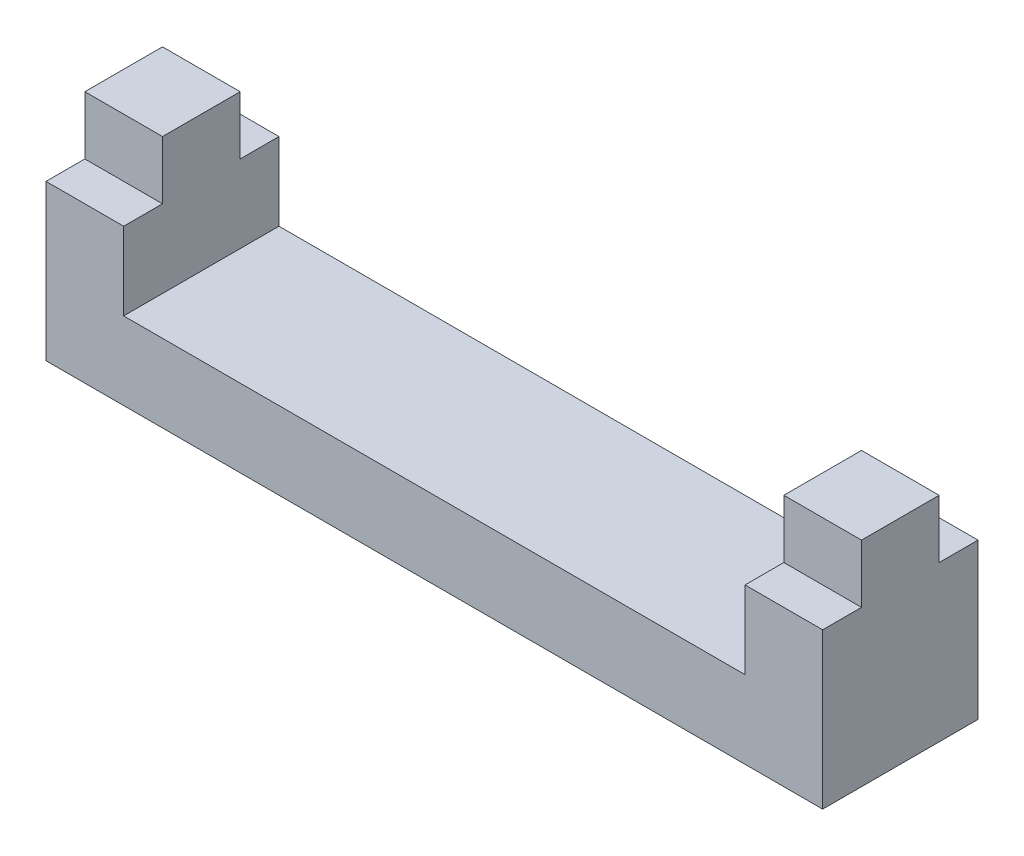
ISO-10303-21;
HEADER;
FILE_DESCRIPTION(('STEP AP214'),'2;1');
FILE_NAME('part.step','',(''),(''),'','','');
FILE_SCHEMA(('AUTOMOTIVE_DESIGN { 1 0 10303 214 1 1 1 1 }'));
ENDSEC;
DATA;
#1=APPLICATION_CONTEXT('core data for automotive mechanical design processes');
#2=APPLICATION_PROTOCOL_DEFINITION('international standard','automotive_design',2000,#1);
#3=PRODUCT_CONTEXT('',#1,'mechanical');
#4=PRODUCT('Part','Part','',(#3));
#5=PRODUCT_RELATED_PRODUCT_CATEGORY('part','',(#4));
#6=PRODUCT_DEFINITION_FORMATION('','',#4);
#7=PRODUCT_DEFINITION_CONTEXT('part definition',#1,'design');
#8=PRODUCT_DEFINITION('design','',#6,#7);
#9=PRODUCT_DEFINITION_SHAPE('','',#8);
#10=(LENGTH_UNIT() NAMED_UNIT(*) SI_UNIT(.MILLI.,.METRE.));
#11=(NAMED_UNIT(*) PLANE_ANGLE_UNIT() SI_UNIT($,.RADIAN.));
#12=(NAMED_UNIT(*) SI_UNIT($,.STERADIAN.) SOLID_ANGLE_UNIT());
#13=UNCERTAINTY_MEASURE_WITH_UNIT(LENGTH_MEASURE(1.E-05),#10,'distance_accuracy_value','');
#14=(GEOMETRIC_REPRESENTATION_CONTEXT(3) GLOBAL_UNCERTAINTY_ASSIGNED_CONTEXT((#13)) GLOBAL_UNIT_ASSIGNED_CONTEXT((#10,
#11,#12)) REPRESENTATION_CONTEXT('',''));
#15=CARTESIAN_POINT('',(0.,0.,0.));
#16=DIRECTION('',(0.,0.,1.));
#17=DIRECTION('',(1.,0.,0.));
#18=AXIS2_PLACEMENT_3D('',#15,#16,#17);
#19=CARTESIAN_POINT('',(0.,5.5,-2.));
#20=DIRECTION('',(-1.,0.,0.));
#21=DIRECTION('',(0.,0.,1.));
#22=AXIS2_PLACEMENT_3D('',#19,#20,#21);
#23=PLANE('',#22);
#24=DIRECTION('',(0.,-1.,0.));
#25=VECTOR('',#24,1.);
#26=CARTESIAN_POINT('',(0.,5.5,2.));
#27=LINE('',#26,#25);
#28=CARTESIAN_POINT('',(0.,4.,2.));
#29=VERTEX_POINT('',#28);
#30=CARTESIAN_POINT('',(0.,0.,2.));
#31=VERTEX_POINT('',#30);
#32=EDGE_CURVE('E262',#29,#31,#27,.T.);
#33=ORIENTED_EDGE('',*,*,#32,.F.);
#34=DIRECTION('',(0.,0.,-1.));
#35=VECTOR('',#34,1.);
#36=CARTESIAN_POINT('',(0.,4.,-2.));
#37=LINE('',#36,#35);
#38=CARTESIAN_POINT('',(0.,4.,1.));
#39=VERTEX_POINT('',#38);
#40=EDGE_CURVE('E55',#29,#39,#37,.T.);
#41=ORIENTED_EDGE('',*,*,#40,.T.);
#42=DIRECTION('',(0.,1.,0.));
#43=VECTOR('',#42,1.);
#44=CARTESIAN_POINT('',(0.,5.5,1.));
#45=LINE('',#44,#43);
#46=CARTESIAN_POINT('',(0.,5.5,1.));
#47=VERTEX_POINT('',#46);
#48=EDGE_CURVE('E285',#39,#47,#45,.T.);
#49=ORIENTED_EDGE('',*,*,#48,.T.);
#50=DIRECTION('',(0.,0.,1.));
#51=VECTOR('',#50,1.);
#52=CARTESIAN_POINT('',(0.,5.5,-2.));
#53=LINE('',#52,#51);
#54=CARTESIAN_POINT('',(0.,5.5,-1.));
#55=VERTEX_POINT('',#54);
#56=EDGE_CURVE('E184',#55,#47,#53,.T.);
#57=ORIENTED_EDGE('',*,*,#56,.F.);
#58=DIRECTION('',(0.,1.,0.));
#59=VECTOR('',#58,1.);
#60=CARTESIAN_POINT('',(0.,5.5,-1.));
#61=LINE('',#60,#59);
#62=CARTESIAN_POINT('',(0.,4.,-1.));
#63=VERTEX_POINT('',#62);
#64=EDGE_CURVE('E264',#63,#55,#61,.T.);
#65=ORIENTED_EDGE('',*,*,#64,.F.);
#66=DIRECTION('',(0.,0.,1.));
#67=VECTOR('',#66,1.);
#68=CARTESIAN_POINT('',(0.,4.,-2.));
#69=LINE('',#68,#67);
#70=CARTESIAN_POINT('',(0.,4.,-2.));
#71=VERTEX_POINT('',#70);
#72=EDGE_CURVE('E272',#71,#63,#69,.T.);
#73=ORIENTED_EDGE('',*,*,#72,.F.);
#74=DIRECTION('',(0.,-1.,0.));
#75=VECTOR('',#74,1.);
#76=CARTESIAN_POINT('',(0.,5.5,-2.));
#77=LINE('',#76,#75);
#78=CARTESIAN_POINT('',(0.,0.,-2.));
#79=VERTEX_POINT('',#78);
#80=EDGE_CURVE('E223',#71,#79,#77,.T.);
#81=ORIENTED_EDGE('',*,*,#80,.T.);
#82=DIRECTION('',(0.,0.,1.));
#83=VECTOR('',#82,1.);
#84=CARTESIAN_POINT('',(0.,0.,-2.));
#85=LINE('',#84,#83);
#86=EDGE_CURVE('E177',#79,#31,#85,.T.);
#87=ORIENTED_EDGE('',*,*,#86,.T.);
#88=EDGE_LOOP('',(#33,#41,#49,#57,#65,#73,#81,#87));
#89=FACE_BOUND('',#88,.T.);
#90=ADVANCED_FACE('F33',(#89),#23,.T.);
#91=CARTESIAN_POINT('',(0.,5.5,-2.));
#92=DIRECTION('',(0.,1.,0.));
#93=DIRECTION('',(-1.,0.,0.));
#94=AXIS2_PLACEMENT_3D('',#91,#92,#93);
#95=PLANE('',#94);
#96=ORIENTED_EDGE('',*,*,#56,.T.);
#97=DIRECTION('',(-1.,0.,0.));
#98=VECTOR('',#97,1.);
#99=CARTESIAN_POINT('',(20.,5.5,1.));
#100=LINE('',#99,#98);
#101=CARTESIAN_POINT('',(2.,5.5,1.));
#102=VERTEX_POINT('',#101);
#103=EDGE_CURVE('E166',#102,#47,#100,.T.);
#104=ORIENTED_EDGE('',*,*,#103,.F.);
#105=DIRECTION('',(0.,0.,1.));
#106=VECTOR('',#105,1.);
#107=CARTESIAN_POINT('',(2.,5.5,-2.));
#108=LINE('',#107,#106);
#109=CARTESIAN_POINT('',(2.,5.5,-1.));
#110=VERTEX_POINT('',#109);
#111=EDGE_CURVE('E190',#110,#102,#108,.T.);
#112=ORIENTED_EDGE('',*,*,#111,.F.);
#113=DIRECTION('',(-1.,0.,0.));
#114=VECTOR('',#113,1.);
#115=CARTESIAN_POINT('',(20.,5.5,-1.));
#116=LINE('',#115,#114);
#117=EDGE_CURVE('E281',#110,#55,#116,.T.);
#118=ORIENTED_EDGE('',*,*,#117,.T.);
#119=EDGE_LOOP('',(#96,#104,#112,#118));
#120=FACE_BOUND('',#119,.T.);
#121=ADVANCED_FACE('F313',(#120),#95,.T.);
#122=CARTESIAN_POINT('',(2.,2.,-2.));
#123=DIRECTION('',(1.,0.,0.));
#124=DIRECTION('',(0.,0.,-1.));
#125=AXIS2_PLACEMENT_3D('',#122,#123,#124);
#126=PLANE('',#125);
#127=DIRECTION('',(0.,-1.,0.));
#128=VECTOR('',#127,1.);
#129=CARTESIAN_POINT('',(2.,2.,1.));
#130=LINE('',#129,#128);
#131=CARTESIAN_POINT('',(2.,4.,1.));
#132=VERTEX_POINT('',#131);
#133=EDGE_CURVE('E288',#102,#132,#130,.T.);
#134=ORIENTED_EDGE('',*,*,#133,.T.);
#135=DIRECTION('',(0.,0.,1.));
#136=VECTOR('',#135,1.);
#137=CARTESIAN_POINT('',(2.,4.,-2.));
#138=LINE('',#137,#136);
#139=CARTESIAN_POINT('',(2.,4.,2.));
#140=VERTEX_POINT('',#139);
#141=EDGE_CURVE('E293',#132,#140,#138,.T.);
#142=ORIENTED_EDGE('',*,*,#141,.T.);
#143=DIRECTION('',(0.,1.,0.));
#144=VECTOR('',#143,1.);
#145=CARTESIAN_POINT('',(2.,2.,2.));
#146=LINE('',#145,#144);
#147=CARTESIAN_POINT('',(2.,2.,2.));
#148=VERTEX_POINT('',#147);
#149=EDGE_CURVE('E221',#148,#140,#146,.T.);
#150=ORIENTED_EDGE('',*,*,#149,.F.);
#151=DIRECTION('',(0.,0.,1.));
#152=VECTOR('',#151,1.);
#153=CARTESIAN_POINT('',(2.,2.,-2.));
#154=LINE('',#153,#152);
#155=CARTESIAN_POINT('',(2.,2.,-2.));
#156=VERTEX_POINT('',#155);
#157=EDGE_CURVE('E197',#156,#148,#154,.T.);
#158=ORIENTED_EDGE('',*,*,#157,.F.);
#159=DIRECTION('',(0.,1.,0.));
#160=VECTOR('',#159,1.);
#161=CARTESIAN_POINT('',(2.,2.,-2.));
#162=LINE('',#161,#160);
#163=CARTESIAN_POINT('',(2.,4.,-2.));
#164=VERTEX_POINT('',#163);
#165=EDGE_CURVE('E182',#156,#164,#162,.T.);
#166=ORIENTED_EDGE('',*,*,#165,.T.);
#167=DIRECTION('',(0.,0.,-1.));
#168=VECTOR('',#167,1.);
#169=CARTESIAN_POINT('',(2.,4.,-2.));
#170=LINE('',#169,#168);
#171=CARTESIAN_POINT('',(2.,4.,-1.));
#172=VERTEX_POINT('',#171);
#173=EDGE_CURVE('E242',#172,#164,#170,.T.);
#174=ORIENTED_EDGE('',*,*,#173,.F.);
#175=DIRECTION('',(0.,-1.,0.));
#176=VECTOR('',#175,1.);
#177=CARTESIAN_POINT('',(2.,2.,-1.));
#178=LINE('',#177,#176);
#179=EDGE_CURVE('E268',#110,#172,#178,.T.);
#180=ORIENTED_EDGE('',*,*,#179,.F.);
#181=ORIENTED_EDGE('',*,*,#111,.T.);
#182=EDGE_LOOP('',(#134,#142,#150,#158,#166,#174,#180,#181));
#183=FACE_BOUND('',#182,.T.);
#184=ADVANCED_FACE('F240',(#183),#126,.T.);
#185=CARTESIAN_POINT('',(18.,2.,-2.));
#186=DIRECTION('',(-1.,0.,0.));
#187=DIRECTION('',(0.,0.,1.));
#188=AXIS2_PLACEMENT_3D('',#185,#186,#187);
#189=PLANE('',#188);
#190=DIRECTION('',(0.,-1.,0.));
#191=VECTOR('',#190,1.);
#192=CARTESIAN_POINT('',(18.,2.,2.));
#193=LINE('',#192,#191);
#194=CARTESIAN_POINT('',(18.,4.,2.));
#195=VERTEX_POINT('',#194);
#196=CARTESIAN_POINT('',(18.,2.,2.));
#197=VERTEX_POINT('',#196);
#198=EDGE_CURVE('E208',#195,#197,#193,.T.);
#199=ORIENTED_EDGE('',*,*,#198,.F.);
#200=DIRECTION('',(0.,0.,-1.));
#201=VECTOR('',#200,1.);
#202=CARTESIAN_POINT('',(18.,4.,-2.));
#203=LINE('',#202,#201);
#204=CARTESIAN_POINT('',(18.,4.,1.));
#205=VERTEX_POINT('',#204);
#206=EDGE_CURVE('E47',#195,#205,#203,.T.);
#207=ORIENTED_EDGE('',*,*,#206,.T.);
#208=DIRECTION('',(0.,1.,0.));
#209=VECTOR('',#208,1.);
#210=CARTESIAN_POINT('',(18.,2.,1.));
#211=LINE('',#210,#209);
#212=CARTESIAN_POINT('',(18.,5.5,1.));
#213=VERTEX_POINT('',#212);
#214=EDGE_CURVE('E290',#205,#213,#211,.T.);
#215=ORIENTED_EDGE('',*,*,#214,.T.);
#216=DIRECTION('',(0.,0.,1.));
#217=VECTOR('',#216,1.);
#218=CARTESIAN_POINT('',(18.,5.5,-2.));
#219=LINE('',#218,#217);
#220=CARTESIAN_POINT('',(18.,5.5,-1.));
#221=VERTEX_POINT('',#220);
#222=EDGE_CURVE('E164',#221,#213,#219,.T.);
#223=ORIENTED_EDGE('',*,*,#222,.F.);
#224=DIRECTION('',(0.,1.,0.));
#225=VECTOR('',#224,1.);
#226=CARTESIAN_POINT('',(18.,2.,-1.));
#227=LINE('',#226,#225);
#228=CARTESIAN_POINT('',(18.,4.,-1.));
#229=VERTEX_POINT('',#228);
#230=EDGE_CURVE('E270',#229,#221,#227,.T.);
#231=ORIENTED_EDGE('',*,*,#230,.F.);
#232=DIRECTION('',(0.,0.,1.));
#233=VECTOR('',#232,1.);
#234=CARTESIAN_POINT('',(18.,4.,-2.));
#235=LINE('',#234,#233);
#236=CARTESIAN_POINT('',(18.,4.,-2.));
#237=VERTEX_POINT('',#236);
#238=EDGE_CURVE('E275',#237,#229,#235,.T.);
#239=ORIENTED_EDGE('',*,*,#238,.F.);
#240=DIRECTION('',(0.,-1.,0.));
#241=VECTOR('',#240,1.);
#242=CARTESIAN_POINT('',(18.,2.,-2.));
#243=LINE('',#242,#241);
#244=CARTESIAN_POINT('',(18.,2.,-2.));
#245=VERTEX_POINT('',#244);
#246=EDGE_CURVE('E211',#237,#245,#243,.T.);
#247=ORIENTED_EDGE('',*,*,#246,.T.);
#248=DIRECTION('',(0.,0.,1.));
#249=VECTOR('',#248,1.);
#250=CARTESIAN_POINT('',(18.,2.,-2.));
#251=LINE('',#250,#249);
#252=EDGE_CURVE('E175',#245,#197,#251,.T.);
#253=ORIENTED_EDGE('',*,*,#252,.T.);
#254=EDGE_LOOP('',(#199,#207,#215,#223,#231,#239,#247,#253));
#255=FACE_BOUND('',#254,.T.);
#256=ADVANCED_FACE('F207',(#255),#189,.T.);
#257=CARTESIAN_POINT('',(20.,5.5,-2.));
#258=DIRECTION('',(0.,1.,0.));
#259=DIRECTION('',(0.,0.,1.));
#260=AXIS2_PLACEMENT_3D('',#257,#258,#259);
#261=PLANE('',#260);
#262=ORIENTED_EDGE('',*,*,#222,.T.);
#263=CARTESIAN_POINT('',(20.,5.5,1.));
#264=VERTEX_POINT('',#263);
#265=EDGE_CURVE('E149',#264,#213,#100,.T.);
#266=ORIENTED_EDGE('',*,*,#265,.F.);
#267=DIRECTION('',(0.,0.,1.));
#268=VECTOR('',#267,1.);
#269=CARTESIAN_POINT('',(20.,5.5,-2.));
#270=LINE('',#269,#268);
#271=CARTESIAN_POINT('',(20.,5.5,-1.));
#272=VERTEX_POINT('',#271);
#273=EDGE_CURVE('E162',#272,#264,#270,.T.);
#274=ORIENTED_EDGE('',*,*,#273,.F.);
#275=EDGE_CURVE('E276',#272,#221,#116,.T.);
#276=ORIENTED_EDGE('',*,*,#275,.T.);
#277=EDGE_LOOP('',(#262,#266,#274,#276));
#278=FACE_BOUND('',#277,.T.);
#279=ADVANCED_FACE('F160',(#278),#261,.T.);
#280=CARTESIAN_POINT('',(20.,0.,-2.));
#281=DIRECTION('',(1.,0.,0.));
#282=DIRECTION('',(0.,0.,-1.));
#283=AXIS2_PLACEMENT_3D('',#280,#281,#282);
#284=PLANE('',#283);
#285=DIRECTION('',(0.,1.,0.));
#286=VECTOR('',#285,1.);
#287=CARTESIAN_POINT('',(20.,5.5,1.));
#288=LINE('',#287,#286);
#289=CARTESIAN_POINT('',(20.,4.,1.));
#290=VERTEX_POINT('',#289);
#291=EDGE_CURVE('E146',#290,#264,#288,.T.);
#292=ORIENTED_EDGE('',*,*,#291,.F.);
#293=DIRECTION('',(0.,0.,-1.));
#294=VECTOR('',#293,1.);
#295=CARTESIAN_POINT('',(20.,4.,2.));
#296=LINE('',#295,#294);
#297=CARTESIAN_POINT('',(20.,4.,2.));
#298=VERTEX_POINT('',#297);
#299=EDGE_CURVE('E155',#298,#290,#296,.T.);
#300=ORIENTED_EDGE('',*,*,#299,.F.);
#301=DIRECTION('',(0.,1.,0.));
#302=VECTOR('',#301,1.);
#303=CARTESIAN_POINT('',(20.,0.,2.));
#304=LINE('',#303,#302);
#305=CARTESIAN_POINT('',(20.,0.,2.));
#306=VERTEX_POINT('',#305);
#307=EDGE_CURVE('E225',#306,#298,#304,.T.);
#308=ORIENTED_EDGE('',*,*,#307,.F.);
#309=DIRECTION('',(0.,0.,1.));
#310=VECTOR('',#309,1.);
#311=CARTESIAN_POINT('',(20.,0.,-2.));
#312=LINE('',#311,#310);
#313=CARTESIAN_POINT('',(20.,0.,-2.));
#314=VERTEX_POINT('',#313);
#315=EDGE_CURVE('E173',#314,#306,#312,.T.);
#316=ORIENTED_EDGE('',*,*,#315,.F.);
#317=DIRECTION('',(0.,1.,0.));
#318=VECTOR('',#317,1.);
#319=CARTESIAN_POINT('',(20.,0.,-2.));
#320=LINE('',#319,#318);
#321=CARTESIAN_POINT('',(20.,4.,-2.));
#322=VERTEX_POINT('',#321);
#323=EDGE_CURVE('E233',#314,#322,#320,.T.);
#324=ORIENTED_EDGE('',*,*,#323,.T.);
#325=DIRECTION('',(0.,0.,1.));
#326=VECTOR('',#325,1.);
#327=CARTESIAN_POINT('',(20.,4.,-2.));
#328=LINE('',#327,#326);
#329=CARTESIAN_POINT('',(20.,4.,-1.));
#330=VERTEX_POINT('',#329);
#331=EDGE_CURVE('E251',#322,#330,#328,.T.);
#332=ORIENTED_EDGE('',*,*,#331,.T.);
#333=DIRECTION('',(0.,1.,0.));
#334=VECTOR('',#333,1.);
#335=CARTESIAN_POINT('',(20.,5.5,-1.));
#336=LINE('',#335,#334);
#337=EDGE_CURVE('E172',#330,#272,#336,.T.);
#338=ORIENTED_EDGE('',*,*,#337,.T.);
#339=ORIENTED_EDGE('',*,*,#273,.T.);
#340=EDGE_LOOP('',(#292,#300,#308,#316,#324,#332,#338,#339));
#341=FACE_BOUND('',#340,.T.);
#342=ADVANCED_FACE('F169',(#341),#284,.T.);
#343=CARTESIAN_POINT('',(0.,0.,2.));
#344=DIRECTION('',(0.,0.,1.));
#345=DIRECTION('',(1.,0.,0.));
#346=AXIS2_PLACEMENT_3D('',#343,#344,#345);
#347=PLANE('',#346);
#348=ORIENTED_EDGE('',*,*,#307,.T.);
#349=DIRECTION('',(-1.,0.,0.));
#350=VECTOR('',#349,1.);
#351=CARTESIAN_POINT('',(20.,4.,2.));
#352=LINE('',#351,#350);
#353=EDGE_CURVE('E296',#298,#195,#352,.T.);
#354=ORIENTED_EDGE('',*,*,#353,.T.);
#355=ORIENTED_EDGE('',*,*,#198,.T.);
#356=DIRECTION('',(-1.,0.,0.));
#357=VECTOR('',#356,1.);
#358=CARTESIAN_POINT('',(2.,2.,2.));
#359=LINE('',#358,#357);
#360=EDGE_CURVE('E216',#197,#148,#359,.T.);
#361=ORIENTED_EDGE('',*,*,#360,.T.);
#362=ORIENTED_EDGE('',*,*,#149,.T.);
#363=DIRECTION('',(-1.,0.,0.));
#364=VECTOR('',#363,1.);
#365=CARTESIAN_POINT('',(0.,4.,2.));
#366=LINE('',#365,#364);
#367=EDGE_CURVE('E11',#140,#29,#366,.T.);
#368=ORIENTED_EDGE('',*,*,#367,.T.);
#369=ORIENTED_EDGE('',*,*,#32,.T.);
#370=DIRECTION('',(1.,0.,0.));
#371=VECTOR('',#370,1.);
#372=CARTESIAN_POINT('',(0.,0.,2.));
#373=LINE('',#372,#371);
#374=EDGE_CURVE('E259',#31,#306,#373,.T.);
#375=ORIENTED_EDGE('',*,*,#374,.T.);
#376=EDGE_LOOP('',(#348,#354,#355,#361,#362,#368,#369,#375));
#377=FACE_BOUND('',#376,.T.);
#378=ADVANCED_FACE('F260',(#377),#347,.T.);
#379=CARTESIAN_POINT('',(2.,2.,-2.));
#380=DIRECTION('',(0.,1.,0.));
#381=DIRECTION('',(0.,0.,1.));
#382=AXIS2_PLACEMENT_3D('',#379,#380,#381);
#383=PLANE('',#382);
#384=ORIENTED_EDGE('',*,*,#157,.T.);
#385=ORIENTED_EDGE('',*,*,#360,.F.);
#386=ORIENTED_EDGE('',*,*,#252,.F.);
#387=DIRECTION('',(-1.,0.,0.));
#388=VECTOR('',#387,1.);
#389=CARTESIAN_POINT('',(2.,2.,-2.));
#390=LINE('',#389,#388);
#391=EDGE_CURVE('E236',#245,#156,#390,.T.);
#392=ORIENTED_EDGE('',*,*,#391,.T.);
#393=EDGE_LOOP('',(#384,#385,#386,#392));
#394=FACE_BOUND('',#393,.T.);
#395=ADVANCED_FACE('F217',(#394),#383,.T.);
#396=CARTESIAN_POINT('',(0.,0.,-2.));
#397=DIRECTION('',(0.,-1.,0.));
#398=DIRECTION('',(0.,0.,-1.));
#399=AXIS2_PLACEMENT_3D('',#396,#397,#398);
#400=PLANE('',#399);
#401=ORIENTED_EDGE('',*,*,#315,.T.);
#402=ORIENTED_EDGE('',*,*,#374,.F.);
#403=ORIENTED_EDGE('',*,*,#86,.F.);
#404=DIRECTION('',(1.,0.,0.));
#405=VECTOR('',#404,1.);
#406=CARTESIAN_POINT('',(0.,0.,-2.));
#407=LINE('',#406,#405);
#408=EDGE_CURVE('E230',#79,#314,#407,.T.);
#409=ORIENTED_EDGE('',*,*,#408,.T.);
#410=EDGE_LOOP('',(#401,#402,#403,#409));
#411=FACE_BOUND('',#410,.T.);
#412=ADVANCED_FACE('F257',(#411),#400,.T.);
#413=CARTESIAN_POINT('',(0.,0.,-2.));
#414=DIRECTION('',(0.,0.,1.));
#415=DIRECTION('',(1.,0.,0.));
#416=AXIS2_PLACEMENT_3D('',#413,#414,#415);
#417=PLANE('',#416);
#418=ORIENTED_EDGE('',*,*,#80,.F.);
#419=DIRECTION('',(1.,0.,0.));
#420=VECTOR('',#419,1.);
#421=CARTESIAN_POINT('',(0.,4.,-2.));
#422=LINE('',#421,#420);
#423=EDGE_CURVE('E40',#71,#164,#422,.T.);
#424=ORIENTED_EDGE('',*,*,#423,.T.);
#425=ORIENTED_EDGE('',*,*,#165,.F.);
#426=ORIENTED_EDGE('',*,*,#391,.F.);
#427=ORIENTED_EDGE('',*,*,#246,.F.);
#428=DIRECTION('',(-1.,0.,0.));
#429=VECTOR('',#428,1.);
#430=CARTESIAN_POINT('',(20.,4.,-2.));
#431=LINE('',#430,#429);
#432=EDGE_CURVE('E246',#322,#237,#431,.T.);
#433=ORIENTED_EDGE('',*,*,#432,.F.);
#434=ORIENTED_EDGE('',*,*,#323,.F.);
#435=ORIENTED_EDGE('',*,*,#408,.F.);
#436=EDGE_LOOP('',(#418,#424,#425,#426,#427,#433,#434,#435));
#437=FACE_BOUND('',#436,.T.);
#438=ADVANCED_FACE('F243',(#437),#417,.F.);
#439=CARTESIAN_POINT('',(20.,4.,-2.));
#440=DIRECTION('',(0.,-1.,0.));
#441=DIRECTION('',(0.,0.,-1.));
#442=AXIS2_PLACEMENT_3D('',#439,#440,#441);
#443=PLANE('',#442);
#444=ORIENTED_EDGE('',*,*,#238,.T.);
#445=DIRECTION('',(-1.,0.,0.));
#446=VECTOR('',#445,1.);
#447=CARTESIAN_POINT('',(20.,4.,-1.));
#448=LINE('',#447,#446);
#449=EDGE_CURVE('E278',#330,#229,#448,.T.);
#450=ORIENTED_EDGE('',*,*,#449,.F.);
#451=ORIENTED_EDGE('',*,*,#331,.F.);
#452=ORIENTED_EDGE('',*,*,#432,.T.);
#453=EDGE_LOOP('',(#444,#450,#451,#452));
#454=FACE_BOUND('',#453,.T.);
#455=ADVANCED_FACE('F335',(#454),#443,.F.);
#456=CARTESIAN_POINT('',(20.,5.5,-1.));
#457=DIRECTION('',(0.,0.,1.));
#458=DIRECTION('',(0.,-1.,0.));
#459=AXIS2_PLACEMENT_3D('',#456,#457,#458);
#460=PLANE('',#459);
#461=ORIENTED_EDGE('',*,*,#230,.T.);
#462=ORIENTED_EDGE('',*,*,#275,.F.);
#463=ORIENTED_EDGE('',*,*,#337,.F.);
#464=ORIENTED_EDGE('',*,*,#449,.T.);
#465=EDGE_LOOP('',(#461,#462,#463,#464));
#466=FACE_BOUND('',#465,.T.);
#467=ADVANCED_FACE('F339',(#466),#460,.F.);
#468=ORIENTED_EDGE('',*,*,#64,.T.);
#469=ORIENTED_EDGE('',*,*,#117,.F.);
#470=ORIENTED_EDGE('',*,*,#179,.T.);
#471=EDGE_CURVE('E249',#172,#63,#448,.T.);
#472=ORIENTED_EDGE('',*,*,#471,.T.);
#473=EDGE_LOOP('',(#468,#469,#470,#472));
#474=FACE_BOUND('',#473,.T.);
#475=ADVANCED_FACE('F312',(#474),#460,.F.);
#476=ORIENTED_EDGE('',*,*,#72,.T.);
#477=ORIENTED_EDGE('',*,*,#471,.F.);
#478=ORIENTED_EDGE('',*,*,#173,.T.);
#479=ORIENTED_EDGE('',*,*,#423,.F.);
#480=EDGE_LOOP('',(#476,#477,#478,#479));
#481=FACE_BOUND('',#480,.T.);
#482=ADVANCED_FACE('F310',(#481),#443,.F.);
#483=CARTESIAN_POINT('',(20.,4.,2.));
#484=DIRECTION('',(0.,1.,0.));
#485=DIRECTION('',(0.,0.,1.));
#486=AXIS2_PLACEMENT_3D('',#483,#484,#485);
#487=PLANE('',#486);
#488=ORIENTED_EDGE('',*,*,#367,.F.);
#489=ORIENTED_EDGE('',*,*,#141,.F.);
#490=DIRECTION('',(-1.,0.,0.));
#491=VECTOR('',#490,1.);
#492=CARTESIAN_POINT('',(20.,4.,1.));
#493=LINE('',#492,#491);
#494=EDGE_CURVE('E165',#132,#39,#493,.T.);
#495=ORIENTED_EDGE('',*,*,#494,.T.);
#496=ORIENTED_EDGE('',*,*,#40,.F.);
#497=EDGE_LOOP('',(#488,#489,#495,#496));
#498=FACE_BOUND('',#497,.T.);
#499=ADVANCED_FACE('F347',(#498),#487,.T.);
#500=CARTESIAN_POINT('',(20.,5.5,1.));
#501=DIRECTION('',(0.,0.,1.));
#502=DIRECTION('',(0.,-1.,0.));
#503=AXIS2_PLACEMENT_3D('',#500,#501,#502);
#504=PLANE('',#503);
#505=ORIENTED_EDGE('',*,*,#494,.F.);
#506=ORIENTED_EDGE('',*,*,#133,.F.);
#507=ORIENTED_EDGE('',*,*,#103,.T.);
#508=ORIENTED_EDGE('',*,*,#48,.F.);
#509=EDGE_LOOP('',(#505,#506,#507,#508));
#510=FACE_BOUND('',#509,.T.);
#511=ADVANCED_FACE('F302',(#510),#504,.T.);
#512=ORIENTED_EDGE('',*,*,#353,.F.);
#513=ORIENTED_EDGE('',*,*,#299,.T.);
#514=EDGE_CURVE('E151',#290,#205,#493,.T.);
#515=ORIENTED_EDGE('',*,*,#514,.T.);
#516=ORIENTED_EDGE('',*,*,#206,.F.);
#517=EDGE_LOOP('',(#512,#513,#515,#516));
#518=FACE_BOUND('',#517,.T.);
#519=ADVANCED_FACE('F353',(#518),#487,.T.);
#520=ORIENTED_EDGE('',*,*,#514,.F.);
#521=ORIENTED_EDGE('',*,*,#291,.T.);
#522=ORIENTED_EDGE('',*,*,#265,.T.);
#523=ORIENTED_EDGE('',*,*,#214,.F.);
#524=EDGE_LOOP('',(#520,#521,#522,#523));
#525=FACE_BOUND('',#524,.T.);
#526=ADVANCED_FACE('F148',(#525),#504,.T.);
#527=CLOSED_SHELL('',(#90,#121,#184,#256,#279,#342,#378,#395,#412,#438,#455,#467,#475,#482,#499,
#511,#519,#526));
#528=MANIFOLD_SOLID_BREP('B2',#527);
#529=ADVANCED_BREP_SHAPE_REPRESENTATION('',(#18,#528),#14);
#530=SHAPE_DEFINITION_REPRESENTATION(#9,#529);
ENDSEC;
END-ISO-10303-21;
